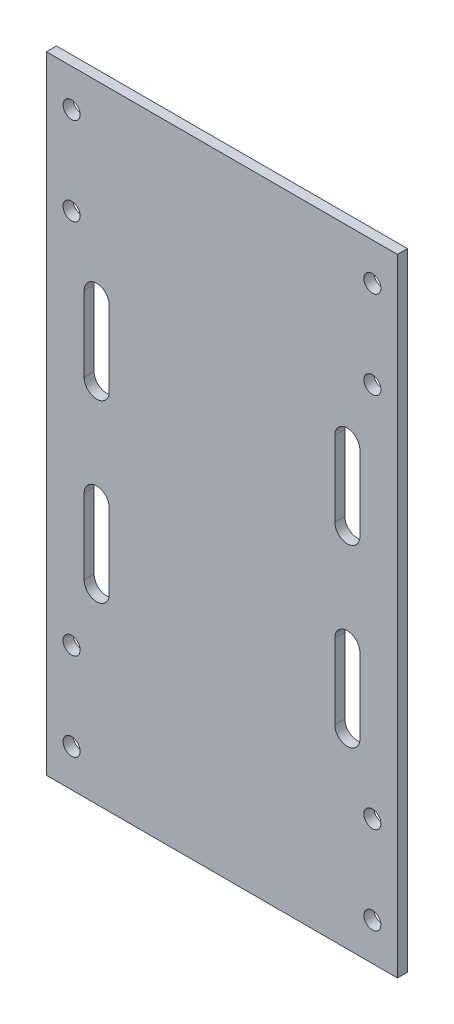
ISO-10303-21;
HEADER;
FILE_DESCRIPTION(('STEP AP214'),'2;1');
FILE_NAME('part.step','',(''),(''),'','','');
FILE_SCHEMA(('AUTOMOTIVE_DESIGN { 1 0 10303 214 1 1 1 1 }'));
ENDSEC;
DATA;
#1=APPLICATION_CONTEXT('core data for automotive mechanical design processes');
#2=APPLICATION_PROTOCOL_DEFINITION('international standard','automotive_design',2000,#1);
#3=PRODUCT_CONTEXT('',#1,'mechanical');
#4=PRODUCT('Part','Part','',(#3));
#5=PRODUCT_RELATED_PRODUCT_CATEGORY('part','',(#4));
#6=PRODUCT_DEFINITION_FORMATION('','',#4);
#7=PRODUCT_DEFINITION_CONTEXT('part definition',#1,'design');
#8=PRODUCT_DEFINITION('design','',#6,#7);
#9=PRODUCT_DEFINITION_SHAPE('','',#8);
#10=(LENGTH_UNIT() NAMED_UNIT(*) SI_UNIT(.MILLI.,.METRE.));
#11=(NAMED_UNIT(*) PLANE_ANGLE_UNIT() SI_UNIT($,.RADIAN.));
#12=(NAMED_UNIT(*) SI_UNIT($,.STERADIAN.) SOLID_ANGLE_UNIT());
#13=UNCERTAINTY_MEASURE_WITH_UNIT(LENGTH_MEASURE(1.E-05),#10,'distance_accuracy_value','');
#14=(GEOMETRIC_REPRESENTATION_CONTEXT(3) GLOBAL_UNCERTAINTY_ASSIGNED_CONTEXT((#13)) GLOBAL_UNIT_ASSIGNED_CONTEXT((#10,
#11,#12)) REPRESENTATION_CONTEXT('',''));
#15=CARTESIAN_POINT('',(0.,0.,0.));
#16=DIRECTION('',(0.,0.,1.));
#17=DIRECTION('',(1.,0.,0.));
#18=AXIS2_PLACEMENT_3D('',#15,#16,#17);
#19=CARTESIAN_POINT('',(0.,0.,0.));
#20=DIRECTION('',(0.,0.,-1.));
#21=DIRECTION('',(-1.,0.,0.));
#22=AXIS2_PLACEMENT_3D('',#19,#20,#21);
#23=PLANE('',#22);
#24=CARTESIAN_POINT('',(25.,-25.,0.));
#25=DIRECTION('',(0.,0.,-1.));
#26=DIRECTION('',(-1.,0.,0.));
#27=AXIS2_PLACEMENT_3D('',#24,#25,#26);
#28=CIRCLE('',#27,2.5);
#29=CARTESIAN_POINT('',(22.5,-25.,0.));
#30=VERTEX_POINT('',#29);
#31=CARTESIAN_POINT('',(27.5,-25.,0.));
#32=VERTEX_POINT('',#31);
#33=EDGE_CURVE('E517',#30,#32,#28,.F.);
#34=ORIENTED_EDGE('',*,*,#33,.F.);
#35=DIRECTION('',(0.,-1.,0.));
#36=VECTOR('',#35,1.);
#37=CARTESIAN_POINT('',(22.5,0.,0.));
#38=LINE('',#37,#36);
#39=CARTESIAN_POINT('',(22.5,-10.,0.));
#40=VERTEX_POINT('',#39);
#41=EDGE_CURVE('E270',#40,#30,#38,.T.);
#42=ORIENTED_EDGE('',*,*,#41,.F.);
#43=CARTESIAN_POINT('',(25.,-10.,0.));
#44=DIRECTION('',(0.,0.,-1.));
#45=DIRECTION('',(-1.,0.,0.));
#46=AXIS2_PLACEMENT_3D('',#43,#44,#45);
#47=CIRCLE('',#46,2.5);
#48=CARTESIAN_POINT('',(27.5,-10.,0.));
#49=VERTEX_POINT('',#48);
#50=EDGE_CURVE('E523',#49,#40,#47,.F.);
#51=ORIENTED_EDGE('',*,*,#50,.F.);
#52=DIRECTION('',(0.,1.,0.));
#53=VECTOR('',#52,1.);
#54=CARTESIAN_POINT('',(27.5,0.,0.));
#55=LINE('',#54,#53);
#56=EDGE_CURVE('E269',#32,#49,#55,.T.);
#57=ORIENTED_EDGE('',*,*,#56,.F.);
#58=EDGE_LOOP('',(#34,#42,#51,#57));
#59=FACE_BOUND('',#58,.T.);
#60=CARTESIAN_POINT('',(-25.,25.,0.));
#61=DIRECTION('',(0.,0.,-1.));
#62=DIRECTION('',(-1.,0.,0.));
#63=AXIS2_PLACEMENT_3D('',#60,#61,#62);
#64=CIRCLE('',#63,2.5);
#65=CARTESIAN_POINT('',(-22.5,25.,0.));
#66=VERTEX_POINT('',#65);
#67=CARTESIAN_POINT('',(-27.5,25.,0.));
#68=VERTEX_POINT('',#67);
#69=EDGE_CURVE('E526',#66,#68,#64,.F.);
#70=ORIENTED_EDGE('',*,*,#69,.F.);
#71=DIRECTION('',(0.,1.,0.));
#72=VECTOR('',#71,1.);
#73=CARTESIAN_POINT('',(-22.5,0.,0.));
#74=LINE('',#73,#72);
#75=CARTESIAN_POINT('',(-22.5,10.,0.));
#76=VERTEX_POINT('',#75);
#77=EDGE_CURVE('E279',#76,#66,#74,.T.);
#78=ORIENTED_EDGE('',*,*,#77,.F.);
#79=CARTESIAN_POINT('',(-25.,10.,0.));
#80=DIRECTION('',(0.,0.,-1.));
#81=DIRECTION('',(-1.,0.,0.));
#82=AXIS2_PLACEMENT_3D('',#79,#80,#81);
#83=CIRCLE('',#82,2.5);
#84=CARTESIAN_POINT('',(-27.5,10.,0.));
#85=VERTEX_POINT('',#84);
#86=EDGE_CURVE('E199',#85,#76,#83,.F.);
#87=ORIENTED_EDGE('',*,*,#86,.F.);
#88=DIRECTION('',(0.,-1.,0.));
#89=VECTOR('',#88,1.);
#90=CARTESIAN_POINT('',(-27.5,0.,0.));
#91=LINE('',#90,#89);
#92=EDGE_CURVE('E271',#68,#85,#91,.T.);
#93=ORIENTED_EDGE('',*,*,#92,.F.);
#94=EDGE_LOOP('',(#70,#78,#87,#93));
#95=FACE_BOUND('',#94,.T.);
#96=CARTESIAN_POINT('',(-25.,-10.,0.));
#97=DIRECTION('',(0.,0.,-1.));
#98=DIRECTION('',(-1.,0.,0.));
#99=AXIS2_PLACEMENT_3D('',#96,#97,#98);
#100=CIRCLE('',#99,2.5);
#101=CARTESIAN_POINT('',(-22.5,-10.,0.));
#102=VERTEX_POINT('',#101);
#103=CARTESIAN_POINT('',(-27.5,-10.,0.));
#104=VERTEX_POINT('',#103);
#105=EDGE_CURVE('E540',#102,#104,#100,.F.);
#106=ORIENTED_EDGE('',*,*,#105,.F.);
#107=DIRECTION('',(0.,1.,0.));
#108=VECTOR('',#107,1.);
#109=CARTESIAN_POINT('',(-22.5,0.,0.));
#110=LINE('',#109,#108);
#111=CARTESIAN_POINT('',(-22.5,-25.,0.));
#112=VERTEX_POINT('',#111);
#113=EDGE_CURVE('E260',#112,#102,#110,.T.);
#114=ORIENTED_EDGE('',*,*,#113,.F.);
#115=CARTESIAN_POINT('',(-25.,-25.,0.));
#116=DIRECTION('',(0.,0.,-1.));
#117=DIRECTION('',(-1.,0.,0.));
#118=AXIS2_PLACEMENT_3D('',#115,#116,#117);
#119=CIRCLE('',#118,2.5);
#120=CARTESIAN_POINT('',(-27.5,-25.,0.));
#121=VERTEX_POINT('',#120);
#122=EDGE_CURVE('E539',#121,#112,#119,.F.);
#123=ORIENTED_EDGE('',*,*,#122,.F.);
#124=DIRECTION('',(0.,-1.,0.));
#125=VECTOR('',#124,1.);
#126=CARTESIAN_POINT('',(-27.5,0.,0.));
#127=LINE('',#126,#125);
#128=EDGE_CURVE('E253',#104,#121,#127,.T.);
#129=ORIENTED_EDGE('',*,*,#128,.F.);
#130=EDGE_LOOP('',(#106,#114,#123,#129));
#131=FACE_BOUND('',#130,.T.);
#132=CARTESIAN_POINT('',(25.,10.,0.));
#133=DIRECTION('',(0.,0.,-1.));
#134=DIRECTION('',(-1.,0.,0.));
#135=AXIS2_PLACEMENT_3D('',#132,#133,#134);
#136=CIRCLE('',#135,2.5);
#137=CARTESIAN_POINT('',(22.5,10.,0.));
#138=VERTEX_POINT('',#137);
#139=CARTESIAN_POINT('',(27.5,10.,0.));
#140=VERTEX_POINT('',#139);
#141=EDGE_CURVE('E527',#138,#140,#136,.F.);
#142=ORIENTED_EDGE('',*,*,#141,.F.);
#143=DIRECTION('',(0.,-1.,0.));
#144=VECTOR('',#143,1.);
#145=CARTESIAN_POINT('',(22.5,0.,0.));
#146=LINE('',#145,#144);
#147=CARTESIAN_POINT('',(22.5,25.,0.));
#148=VERTEX_POINT('',#147);
#149=EDGE_CURVE('E262',#148,#138,#146,.T.);
#150=ORIENTED_EDGE('',*,*,#149,.F.);
#151=CARTESIAN_POINT('',(25.,25.,0.));
#152=DIRECTION('',(0.,0.,-1.));
#153=DIRECTION('',(-1.,0.,0.));
#154=AXIS2_PLACEMENT_3D('',#151,#152,#153);
#155=CIRCLE('',#154,2.5);
#156=CARTESIAN_POINT('',(27.5,25.,0.));
#157=VERTEX_POINT('',#156);
#158=EDGE_CURVE('E534',#157,#148,#155,.F.);
#159=ORIENTED_EDGE('',*,*,#158,.F.);
#160=DIRECTION('',(0.,1.,0.));
#161=VECTOR('',#160,1.);
#162=CARTESIAN_POINT('',(27.5,0.,0.));
#163=LINE('',#162,#161);
#164=EDGE_CURVE('E261',#140,#157,#163,.T.);
#165=ORIENTED_EDGE('',*,*,#164,.F.);
#166=EDGE_LOOP('',(#142,#150,#159,#165));
#167=FACE_BOUND('',#166,.T.);
#168=DIRECTION('',(0.,1.,0.));
#169=VECTOR('',#168,1.);
#170=CARTESIAN_POINT('',(35.,-62.5,0.));
#171=LINE('',#170,#169);
#172=CARTESIAN_POINT('',(35.,-62.5,0.));
#173=VERTEX_POINT('',#172);
#174=CARTESIAN_POINT('',(35.,62.5,0.));
#175=VERTEX_POINT('',#174);
#176=EDGE_CURVE('E855',#173,#175,#171,.T.);
#177=ORIENTED_EDGE('',*,*,#176,.T.);
#178=DIRECTION('',(-1.,0.,0.));
#179=VECTOR('',#178,1.);
#180=CARTESIAN_POINT('',(-35.,62.5,0.));
#181=LINE('',#180,#179);
#182=CARTESIAN_POINT('',(-35.,62.5,0.));
#183=VERTEX_POINT('',#182);
#184=EDGE_CURVE('E854',#175,#183,#181,.T.);
#185=ORIENTED_EDGE('',*,*,#184,.T.);
#186=DIRECTION('',(0.,-1.,0.));
#187=VECTOR('',#186,1.);
#188=CARTESIAN_POINT('',(-35.,-62.5,0.));
#189=LINE('',#188,#187);
#190=CARTESIAN_POINT('',(-35.,-62.5,0.));
#191=VERTEX_POINT('',#190);
#192=EDGE_CURVE('E859',#183,#191,#189,.T.);
#193=ORIENTED_EDGE('',*,*,#192,.T.);
#194=DIRECTION('',(1.,0.,0.));
#195=VECTOR('',#194,1.);
#196=CARTESIAN_POINT('',(-35.,-62.5,0.));
#197=LINE('',#196,#195);
#198=EDGE_CURVE('E860',#191,#173,#197,.T.);
#199=ORIENTED_EDGE('',*,*,#198,.T.);
#200=EDGE_LOOP('',(#177,#185,#193,#199));
#201=FACE_BOUND('',#200,.T.);
#202=CARTESIAN_POINT('',(-30.,-55.,1.2E-05));
#203=DIRECTION('',(0.,0.,1.));
#204=DIRECTION('',(1.,0.,0.));
#205=AXIS2_PLACEMENT_3D('',#202,#203,#204);
#206=CIRCLE('',#205,1.7);
#207=CARTESIAN_POINT('',(-28.3,-55.,1.2E-05));
#208=VERTEX_POINT('',#207);
#209=EDGE_CURVE('E307',#208,#208,#206,.T.);
#210=ORIENTED_EDGE('',*,*,#209,.F.);
#211=EDGE_LOOP('',(#210));
#212=FACE_BOUND('',#211,.T.);
#213=CARTESIAN_POINT('',(30.,55.,1.2E-05));
#214=DIRECTION('',(0.,0.,1.));
#215=DIRECTION('',(1.,0.,0.));
#216=AXIS2_PLACEMENT_3D('',#213,#214,#215);
#217=CIRCLE('',#216,1.7);
#218=CARTESIAN_POINT('',(31.7,55.,1.2E-05));
#219=VERTEX_POINT('',#218);
#220=EDGE_CURVE('E280',#219,#219,#217,.T.);
#221=ORIENTED_EDGE('',*,*,#220,.F.);
#222=EDGE_LOOP('',(#221));
#223=FACE_BOUND('',#222,.T.);
#224=CARTESIAN_POINT('',(30.,37.5,1.2E-05));
#225=DIRECTION('',(0.,0.,1.));
#226=DIRECTION('',(1.,0.,0.));
#227=AXIS2_PLACEMENT_3D('',#224,#225,#226);
#228=CIRCLE('',#227,1.7);
#229=CARTESIAN_POINT('',(31.7,37.5,1.2E-05));
#230=VERTEX_POINT('',#229);
#231=EDGE_CURVE('E290',#230,#230,#228,.T.);
#232=ORIENTED_EDGE('',*,*,#231,.F.);
#233=EDGE_LOOP('',(#232));
#234=FACE_BOUND('',#233,.T.);
#235=CARTESIAN_POINT('',(30.,-37.5,1.2E-05));
#236=DIRECTION('',(0.,0.,1.));
#237=DIRECTION('',(1.,0.,0.));
#238=AXIS2_PLACEMENT_3D('',#235,#236,#237);
#239=CIRCLE('',#238,1.7);
#240=CARTESIAN_POINT('',(31.7,-37.5,1.2E-05));
#241=VERTEX_POINT('',#240);
#242=EDGE_CURVE('E284',#241,#241,#239,.T.);
#243=ORIENTED_EDGE('',*,*,#242,.F.);
#244=EDGE_LOOP('',(#243));
#245=FACE_BOUND('',#244,.T.);
#246=CARTESIAN_POINT('',(-30.,-37.5,1.2E-05));
#247=DIRECTION('',(0.,0.,1.));
#248=DIRECTION('',(1.,0.,0.));
#249=AXIS2_PLACEMENT_3D('',#246,#247,#248);
#250=CIRCLE('',#249,1.7);
#251=CARTESIAN_POINT('',(-28.3,-37.5,1.2E-05));
#252=VERTEX_POINT('',#251);
#253=EDGE_CURVE('E303',#252,#252,#250,.T.);
#254=ORIENTED_EDGE('',*,*,#253,.F.);
#255=EDGE_LOOP('',(#254));
#256=FACE_BOUND('',#255,.T.);
#257=CARTESIAN_POINT('',(-30.,37.5,1.2E-05));
#258=DIRECTION('',(0.,0.,1.));
#259=DIRECTION('',(1.,0.,0.));
#260=AXIS2_PLACEMENT_3D('',#257,#258,#259);
#261=CIRCLE('',#260,1.7);
#262=CARTESIAN_POINT('',(-28.3,37.5,1.2E-05));
#263=VERTEX_POINT('',#262);
#264=EDGE_CURVE('E295',#263,#263,#261,.T.);
#265=ORIENTED_EDGE('',*,*,#264,.F.);
#266=EDGE_LOOP('',(#265));
#267=FACE_BOUND('',#266,.T.);
#268=CARTESIAN_POINT('',(-30.,55.,1.2E-05));
#269=DIRECTION('',(0.,0.,1.));
#270=DIRECTION('',(1.,0.,0.));
#271=AXIS2_PLACEMENT_3D('',#268,#269,#270);
#272=CIRCLE('',#271,1.7);
#273=CARTESIAN_POINT('',(-28.3,55.,1.2E-05));
#274=VERTEX_POINT('',#273);
#275=EDGE_CURVE('E294',#274,#274,#272,.T.);
#276=ORIENTED_EDGE('',*,*,#275,.F.);
#277=EDGE_LOOP('',(#276));
#278=FACE_BOUND('',#277,.T.);
#279=CARTESIAN_POINT('',(30.,-55.,1.2E-05));
#280=DIRECTION('',(0.,0.,1.));
#281=DIRECTION('',(1.,0.,0.));
#282=AXIS2_PLACEMENT_3D('',#279,#280,#281);
#283=CIRCLE('',#282,1.7);
#284=CARTESIAN_POINT('',(31.7,-55.,1.2E-05));
#285=VERTEX_POINT('',#284);
#286=EDGE_CURVE('E285',#285,#285,#283,.T.);
#287=ORIENTED_EDGE('',*,*,#286,.F.);
#288=EDGE_LOOP('',(#287));
#289=FACE_BOUND('',#288,.T.);
#290=ADVANCED_FACE('F44',(#59,#95,#131,#167,#201,#212,#223,#234,#245,#256,#267,#278,#289),#23,.F.);
#291=CARTESIAN_POINT('',(0.,0.,-2.));
#292=DIRECTION('',(0.,0.,-1.));
#293=DIRECTION('',(-1.,0.,0.));
#294=AXIS2_PLACEMENT_3D('',#291,#292,#293);
#295=PLANE('',#294);
#296=CARTESIAN_POINT('',(30.,-55.,-2.));
#297=DIRECTION('',(0.,0.,1.));
#298=DIRECTION('',(1.,0.,0.));
#299=AXIS2_PLACEMENT_3D('',#296,#297,#298);
#300=CIRCLE('',#299,1.7);
#301=CARTESIAN_POINT('',(31.7,-55.,-2.));
#302=VERTEX_POINT('',#301);
#303=EDGE_CURVE('E298',#302,#302,#300,.T.);
#304=ORIENTED_EDGE('',*,*,#303,.T.);
#305=EDGE_LOOP('',(#304));
#306=FACE_BOUND('',#305,.T.);
#307=CARTESIAN_POINT('',(-30.,55.,-2.));
#308=DIRECTION('',(0.,0.,1.));
#309=DIRECTION('',(1.,0.,0.));
#310=AXIS2_PLACEMENT_3D('',#307,#308,#309);
#311=CIRCLE('',#310,1.7);
#312=CARTESIAN_POINT('',(-28.3,55.,-2.));
#313=VERTEX_POINT('',#312);
#314=EDGE_CURVE('E293',#313,#313,#311,.T.);
#315=ORIENTED_EDGE('',*,*,#314,.T.);
#316=EDGE_LOOP('',(#315));
#317=FACE_BOUND('',#316,.T.);
#318=CARTESIAN_POINT('',(-30.,37.5,-2.));
#319=DIRECTION('',(0.,0.,1.));
#320=DIRECTION('',(1.,0.,0.));
#321=AXIS2_PLACEMENT_3D('',#318,#319,#320);
#322=CIRCLE('',#321,1.7);
#323=CARTESIAN_POINT('',(-28.3,37.5,-2.));
#324=VERTEX_POINT('',#323);
#325=EDGE_CURVE('E302',#324,#324,#322,.T.);
#326=ORIENTED_EDGE('',*,*,#325,.T.);
#327=EDGE_LOOP('',(#326));
#328=FACE_BOUND('',#327,.T.);
#329=CARTESIAN_POINT('',(-30.,-37.5,-2.));
#330=DIRECTION('',(0.,0.,1.));
#331=DIRECTION('',(1.,0.,0.));
#332=AXIS2_PLACEMENT_3D('',#329,#330,#331);
#333=CIRCLE('',#332,1.7);
#334=CARTESIAN_POINT('',(-28.3,-37.5,-2.));
#335=VERTEX_POINT('',#334);
#336=EDGE_CURVE('E299',#335,#335,#333,.T.);
#337=ORIENTED_EDGE('',*,*,#336,.T.);
#338=EDGE_LOOP('',(#337));
#339=FACE_BOUND('',#338,.T.);
#340=CARTESIAN_POINT('',(30.,-37.5,-2.));
#341=DIRECTION('',(0.,0.,1.));
#342=DIRECTION('',(1.,0.,0.));
#343=AXIS2_PLACEMENT_3D('',#340,#341,#342);
#344=CIRCLE('',#343,1.7);
#345=CARTESIAN_POINT('',(31.7,-37.5,-2.));
#346=VERTEX_POINT('',#345);
#347=EDGE_CURVE('E278',#346,#346,#344,.T.);
#348=ORIENTED_EDGE('',*,*,#347,.T.);
#349=EDGE_LOOP('',(#348));
#350=FACE_BOUND('',#349,.T.);
#351=CARTESIAN_POINT('',(30.,37.5,-2.));
#352=DIRECTION('',(0.,0.,1.));
#353=DIRECTION('',(1.,0.,0.));
#354=AXIS2_PLACEMENT_3D('',#351,#352,#353);
#355=CIRCLE('',#354,1.7);
#356=CARTESIAN_POINT('',(31.7,37.5,-2.));
#357=VERTEX_POINT('',#356);
#358=EDGE_CURVE('E281',#357,#357,#355,.T.);
#359=ORIENTED_EDGE('',*,*,#358,.T.);
#360=EDGE_LOOP('',(#359));
#361=FACE_BOUND('',#360,.T.);
#362=CARTESIAN_POINT('',(30.,55.,-2.));
#363=DIRECTION('',(0.,0.,1.));
#364=DIRECTION('',(1.,0.,0.));
#365=AXIS2_PLACEMENT_3D('',#362,#363,#364);
#366=CIRCLE('',#365,1.7);
#367=CARTESIAN_POINT('',(31.7,55.,-2.));
#368=VERTEX_POINT('',#367);
#369=EDGE_CURVE('E287',#368,#368,#366,.T.);
#370=ORIENTED_EDGE('',*,*,#369,.T.);
#371=EDGE_LOOP('',(#370));
#372=FACE_BOUND('',#371,.T.);
#373=CARTESIAN_POINT('',(-30.,-55.,-2.));
#374=DIRECTION('',(0.,0.,1.));
#375=DIRECTION('',(1.,0.,0.));
#376=AXIS2_PLACEMENT_3D('',#373,#374,#375);
#377=CIRCLE('',#376,1.7);
#378=CARTESIAN_POINT('',(-28.3,-55.,-2.));
#379=VERTEX_POINT('',#378);
#380=EDGE_CURVE('E305',#379,#379,#377,.T.);
#381=ORIENTED_EDGE('',*,*,#380,.T.);
#382=EDGE_LOOP('',(#381));
#383=FACE_BOUND('',#382,.T.);
#384=DIRECTION('',(0.,1.,0.));
#385=VECTOR('',#384,1.);
#386=CARTESIAN_POINT('',(35.,-62.5,-2.));
#387=LINE('',#386,#385);
#388=CARTESIAN_POINT('',(35.,-62.5,-2.));
#389=VERTEX_POINT('',#388);
#390=CARTESIAN_POINT('',(35.,62.5,-2.));
#391=VERTEX_POINT('',#390);
#392=EDGE_CURVE('E410',#389,#391,#387,.T.);
#393=ORIENTED_EDGE('',*,*,#392,.F.);
#394=DIRECTION('',(1.,0.,0.));
#395=VECTOR('',#394,1.);
#396=CARTESIAN_POINT('',(-35.,-62.5,-2.));
#397=LINE('',#396,#395);
#398=CARTESIAN_POINT('',(-35.,-62.5,-2.));
#399=VERTEX_POINT('',#398);
#400=EDGE_CURVE('E869',#399,#389,#397,.T.);
#401=ORIENTED_EDGE('',*,*,#400,.F.);
#402=DIRECTION('',(0.,-1.,0.));
#403=VECTOR('',#402,1.);
#404=CARTESIAN_POINT('',(-35.,-62.5,-2.));
#405=LINE('',#404,#403);
#406=CARTESIAN_POINT('',(-35.,62.5,-2.));
#407=VERTEX_POINT('',#406);
#408=EDGE_CURVE('E894',#407,#399,#405,.T.);
#409=ORIENTED_EDGE('',*,*,#408,.F.);
#410=DIRECTION('',(-1.,0.,0.));
#411=VECTOR('',#410,1.);
#412=CARTESIAN_POINT('',(-35.,62.5,-2.));
#413=LINE('',#412,#411);
#414=EDGE_CURVE('E864',#391,#407,#413,.T.);
#415=ORIENTED_EDGE('',*,*,#414,.F.);
#416=EDGE_LOOP('',(#393,#401,#409,#415));
#417=FACE_BOUND('',#416,.T.);
#418=DIRECTION('',(0.,1.,0.));
#419=VECTOR('',#418,1.);
#420=CARTESIAN_POINT('',(-22.5,-25.,-2.));
#421=LINE('',#420,#419);
#422=CARTESIAN_POINT('',(-22.5,-25.,-2.));
#423=VERTEX_POINT('',#422);
#424=CARTESIAN_POINT('',(-22.5,-10.,-2.));
#425=VERTEX_POINT('',#424);
#426=EDGE_CURVE('E216',#423,#425,#421,.T.);
#427=ORIENTED_EDGE('',*,*,#426,.T.);
#428=CARTESIAN_POINT('',(-25.,-10.,-2.));
#429=DIRECTION('',(0.,0.,1.));
#430=DIRECTION('',(1.,0.,0.));
#431=AXIS2_PLACEMENT_3D('',#428,#429,#430);
#432=CIRCLE('',#431,2.5);
#433=CARTESIAN_POINT('',(-27.5,-10.,-2.));
#434=VERTEX_POINT('',#433);
#435=EDGE_CURVE('E215',#425,#434,#432,.T.);
#436=ORIENTED_EDGE('',*,*,#435,.T.);
#437=DIRECTION('',(0.,-1.,0.));
#438=VECTOR('',#437,1.);
#439=CARTESIAN_POINT('',(-27.5,-25.,-2.));
#440=LINE('',#439,#438);
#441=CARTESIAN_POINT('',(-27.5,-25.,-2.));
#442=VERTEX_POINT('',#441);
#443=EDGE_CURVE('E225',#434,#442,#440,.T.);
#444=ORIENTED_EDGE('',*,*,#443,.T.);
#445=CARTESIAN_POINT('',(-25.,-25.,-2.));
#446=DIRECTION('',(0.,0.,1.));
#447=DIRECTION('',(1.,0.,0.));
#448=AXIS2_PLACEMENT_3D('',#445,#446,#447);
#449=CIRCLE('',#448,2.5);
#450=EDGE_CURVE('E565',#442,#423,#449,.T.);
#451=ORIENTED_EDGE('',*,*,#450,.T.);
#452=EDGE_LOOP('',(#427,#436,#444,#451));
#453=FACE_BOUND('',#452,.T.);
#454=DIRECTION('',(0.,-1.,0.));
#455=VECTOR('',#454,1.);
#456=CARTESIAN_POINT('',(22.5,10.,-2.));
#457=LINE('',#456,#455);
#458=CARTESIAN_POINT('',(22.5,25.,-2.));
#459=VERTEX_POINT('',#458);
#460=CARTESIAN_POINT('',(22.5,10.,-2.));
#461=VERTEX_POINT('',#460);
#462=EDGE_CURVE('E506',#459,#461,#457,.T.);
#463=ORIENTED_EDGE('',*,*,#462,.T.);
#464=CARTESIAN_POINT('',(25.,10.,-2.));
#465=DIRECTION('',(0.,0.,1.));
#466=DIRECTION('',(1.,0.,0.));
#467=AXIS2_PLACEMENT_3D('',#464,#465,#466);
#468=CIRCLE('',#467,2.5);
#469=CARTESIAN_POINT('',(27.5,10.,-2.));
#470=VERTEX_POINT('',#469);
#471=EDGE_CURVE('E569',#461,#470,#468,.T.);
#472=ORIENTED_EDGE('',*,*,#471,.T.);
#473=DIRECTION('',(0.,1.,0.));
#474=VECTOR('',#473,1.);
#475=CARTESIAN_POINT('',(27.5,10.,-2.));
#476=LINE('',#475,#474);
#477=CARTESIAN_POINT('',(27.5,25.,-2.));
#478=VERTEX_POINT('',#477);
#479=EDGE_CURVE('E229',#470,#478,#476,.T.);
#480=ORIENTED_EDGE('',*,*,#479,.T.);
#481=CARTESIAN_POINT('',(25.,25.,-2.));
#482=DIRECTION('',(0.,0.,1.));
#483=DIRECTION('',(1.,0.,0.));
#484=AXIS2_PLACEMENT_3D('',#481,#482,#483);
#485=CIRCLE('',#484,2.5);
#486=EDGE_CURVE('E568',#478,#459,#485,.T.);
#487=ORIENTED_EDGE('',*,*,#486,.T.);
#488=EDGE_LOOP('',(#463,#472,#480,#487));
#489=FACE_BOUND('',#488,.T.);
#490=DIRECTION('',(0.,-1.,0.));
#491=VECTOR('',#490,1.);
#492=CARTESIAN_POINT('',(22.5,-25.,-2.));
#493=LINE('',#492,#491);
#494=CARTESIAN_POINT('',(22.5,-10.,-2.));
#495=VERTEX_POINT('',#494);
#496=CARTESIAN_POINT('',(22.5,-25.,-2.));
#497=VERTEX_POINT('',#496);
#498=EDGE_CURVE('E240',#495,#497,#493,.T.);
#499=ORIENTED_EDGE('',*,*,#498,.T.);
#500=CARTESIAN_POINT('',(25.,-25.,-2.));
#501=DIRECTION('',(0.,0.,1.));
#502=DIRECTION('',(1.,0.,0.));
#503=AXIS2_PLACEMENT_3D('',#500,#501,#502);
#504=CIRCLE('',#503,2.5);
#505=CARTESIAN_POINT('',(27.5,-25.,-2.));
#506=VERTEX_POINT('',#505);
#507=EDGE_CURVE('E509',#497,#506,#504,.T.);
#508=ORIENTED_EDGE('',*,*,#507,.T.);
#509=DIRECTION('',(0.,1.,0.));
#510=VECTOR('',#509,1.);
#511=CARTESIAN_POINT('',(27.5,-25.,-2.));
#512=LINE('',#511,#510);
#513=CARTESIAN_POINT('',(27.5,-10.,-2.));
#514=VERTEX_POINT('',#513);
#515=EDGE_CURVE('E239',#506,#514,#512,.T.);
#516=ORIENTED_EDGE('',*,*,#515,.T.);
#517=CARTESIAN_POINT('',(25.,-10.,-2.));
#518=DIRECTION('',(0.,0.,1.));
#519=DIRECTION('',(1.,0.,0.));
#520=AXIS2_PLACEMENT_3D('',#517,#518,#519);
#521=CIRCLE('',#520,2.5);
#522=EDGE_CURVE('E515',#514,#495,#521,.T.);
#523=ORIENTED_EDGE('',*,*,#522,.T.);
#524=EDGE_LOOP('',(#499,#508,#516,#523));
#525=FACE_BOUND('',#524,.T.);
#526=DIRECTION('',(0.,1.,0.));
#527=VECTOR('',#526,1.);
#528=CARTESIAN_POINT('',(-22.5,10.,-2.));
#529=LINE('',#528,#527);
#530=CARTESIAN_POINT('',(-22.5,10.,-2.));
#531=VERTEX_POINT('',#530);
#532=CARTESIAN_POINT('',(-22.5,25.,-2.));
#533=VERTEX_POINT('',#532);
#534=EDGE_CURVE('E214',#531,#533,#529,.T.);
#535=ORIENTED_EDGE('',*,*,#534,.T.);
#536=CARTESIAN_POINT('',(-25.,25.,-2.));
#537=DIRECTION('',(0.,0.,1.));
#538=DIRECTION('',(1.,0.,0.));
#539=AXIS2_PLACEMENT_3D('',#536,#537,#538);
#540=CIRCLE('',#539,2.5);
#541=CARTESIAN_POINT('',(-27.5,25.,-2.));
#542=VERTEX_POINT('',#541);
#543=EDGE_CURVE('E213',#533,#542,#540,.T.);
#544=ORIENTED_EDGE('',*,*,#543,.T.);
#545=DIRECTION('',(0.,-1.,0.));
#546=VECTOR('',#545,1.);
#547=CARTESIAN_POINT('',(-27.5,10.,-2.));
#548=LINE('',#547,#546);
#549=CARTESIAN_POINT('',(-27.5,10.,-2.));
#550=VERTEX_POINT('',#549);
#551=EDGE_CURVE('E202',#542,#550,#548,.T.);
#552=ORIENTED_EDGE('',*,*,#551,.T.);
#553=CARTESIAN_POINT('',(-25.,10.,-2.));
#554=DIRECTION('',(0.,0.,1.));
#555=DIRECTION('',(1.,0.,0.));
#556=AXIS2_PLACEMENT_3D('',#553,#554,#555);
#557=CIRCLE('',#556,2.5);
#558=EDGE_CURVE('E192',#550,#531,#557,.T.);
#559=ORIENTED_EDGE('',*,*,#558,.T.);
#560=EDGE_LOOP('',(#535,#544,#552,#559));
#561=FACE_BOUND('',#560,.T.);
#562=ADVANCED_FACE('F209',(#306,#317,#328,#339,#350,#361,#372,#383,#417,#453,#489,#525,#561),
#295,.T.);
#563=CARTESIAN_POINT('',(35.,-62.5,-2.));
#564=DIRECTION('',(1.,0.,0.));
#565=DIRECTION('',(0.,0.,-1.));
#566=AXIS2_PLACEMENT_3D('',#563,#564,#565);
#567=PLANE('',#566);
#568=ORIENTED_EDGE('',*,*,#176,.F.);
#569=DIRECTION('',(0.,0.,1.));
#570=VECTOR('',#569,1.);
#571=CARTESIAN_POINT('',(35.,-62.5,-2.));
#572=LINE('',#571,#570);
#573=EDGE_CURVE('E11',#389,#173,#572,.T.);
#574=ORIENTED_EDGE('',*,*,#573,.F.);
#575=ORIENTED_EDGE('',*,*,#392,.T.);
#576=DIRECTION('',(0.,0.,1.));
#577=VECTOR('',#576,1.);
#578=CARTESIAN_POINT('',(35.,62.5,-2.));
#579=LINE('',#578,#577);
#580=EDGE_CURVE('E95',#391,#175,#579,.T.);
#581=ORIENTED_EDGE('',*,*,#580,.T.);
#582=EDGE_LOOP('',(#568,#574,#575,#581));
#583=FACE_BOUND('',#582,.T.);
#584=ADVANCED_FACE('F50',(#583),#567,.T.);
#585=CARTESIAN_POINT('',(-35.,-62.5,-2.));
#586=DIRECTION('',(0.,-1.,0.));
#587=DIRECTION('',(0.,0.,-1.));
#588=AXIS2_PLACEMENT_3D('',#585,#586,#587);
#589=PLANE('',#588);
#590=ORIENTED_EDGE('',*,*,#198,.F.);
#591=DIRECTION('',(0.,0.,1.));
#592=VECTOR('',#591,1.);
#593=CARTESIAN_POINT('',(-35.,-62.5,-2.));
#594=LINE('',#593,#592);
#595=EDGE_CURVE('E60',#399,#191,#594,.T.);
#596=ORIENTED_EDGE('',*,*,#595,.F.);
#597=ORIENTED_EDGE('',*,*,#400,.T.);
#598=ORIENTED_EDGE('',*,*,#573,.T.);
#599=EDGE_LOOP('',(#590,#596,#597,#598));
#600=FACE_BOUND('',#599,.T.);
#601=ADVANCED_FACE('F428',(#600),#589,.T.);
#602=CARTESIAN_POINT('',(-35.,-62.5,-2.));
#603=DIRECTION('',(-1.,0.,0.));
#604=DIRECTION('',(0.,0.,1.));
#605=AXIS2_PLACEMENT_3D('',#602,#603,#604);
#606=PLANE('',#605);
#607=ORIENTED_EDGE('',*,*,#192,.F.);
#608=DIRECTION('',(0.,0.,1.));
#609=VECTOR('',#608,1.);
#610=CARTESIAN_POINT('',(-35.,62.5,-2.));
#611=LINE('',#610,#609);
#612=EDGE_CURVE('E867',#407,#183,#611,.T.);
#613=ORIENTED_EDGE('',*,*,#612,.F.);
#614=ORIENTED_EDGE('',*,*,#408,.T.);
#615=ORIENTED_EDGE('',*,*,#595,.T.);
#616=EDGE_LOOP('',(#607,#613,#614,#615));
#617=FACE_BOUND('',#616,.T.);
#618=ADVANCED_FACE('F713',(#617),#606,.T.);
#619=CARTESIAN_POINT('',(-35.,62.5,-2.));
#620=DIRECTION('',(0.,1.,0.));
#621=DIRECTION('',(0.,0.,1.));
#622=AXIS2_PLACEMENT_3D('',#619,#620,#621);
#623=PLANE('',#622);
#624=ORIENTED_EDGE('',*,*,#184,.F.);
#625=ORIENTED_EDGE('',*,*,#580,.F.);
#626=ORIENTED_EDGE('',*,*,#414,.T.);
#627=ORIENTED_EDGE('',*,*,#612,.T.);
#628=EDGE_LOOP('',(#624,#625,#626,#627));
#629=FACE_BOUND('',#628,.T.);
#630=ADVANCED_FACE('F418',(#629),#623,.T.);
#631=CARTESIAN_POINT('',(-30.,-55.,1.2E-05));
#632=DIRECTION('',(0.,0.,-1.));
#633=DIRECTION('',(-1.,0.,0.));
#634=AXIS2_PLACEMENT_3D('',#631,#632,#633);
#635=CYLINDRICAL_SURFACE('',#634,1.7);
#636=ORIENTED_EDGE('',*,*,#209,.T.);
#637=EDGE_LOOP('',(#636));
#638=FACE_BOUND('',#637,.T.);
#639=ORIENTED_EDGE('',*,*,#380,.F.);
#640=EDGE_LOOP('',(#639));
#641=FACE_BOUND('',#640,.T.);
#642=ADVANCED_FACE('F407',(#638,#641),#635,.F.);
#643=CARTESIAN_POINT('',(30.,55.,1.2E-05));
#644=DIRECTION('',(0.,0.,-1.));
#645=DIRECTION('',(-1.,0.,0.));
#646=AXIS2_PLACEMENT_3D('',#643,#644,#645);
#647=CYLINDRICAL_SURFACE('',#646,1.7);
#648=ORIENTED_EDGE('',*,*,#220,.T.);
#649=EDGE_LOOP('',(#648));
#650=FACE_BOUND('',#649,.T.);
#651=ORIENTED_EDGE('',*,*,#369,.F.);
#652=EDGE_LOOP('',(#651));
#653=FACE_BOUND('',#652,.T.);
#654=ADVANCED_FACE('F377',(#650,#653),#647,.F.);
#655=CARTESIAN_POINT('',(30.,37.5,1.2E-05));
#656=DIRECTION('',(0.,0.,-1.));
#657=DIRECTION('',(-1.,0.,0.));
#658=AXIS2_PLACEMENT_3D('',#655,#656,#657);
#659=CYLINDRICAL_SURFACE('',#658,1.7);
#660=ORIENTED_EDGE('',*,*,#231,.T.);
#661=EDGE_LOOP('',(#660));
#662=FACE_BOUND('',#661,.T.);
#663=ORIENTED_EDGE('',*,*,#358,.F.);
#664=EDGE_LOOP('',(#663));
#665=FACE_BOUND('',#664,.T.);
#666=ADVANCED_FACE('F372',(#662,#665),#659,.F.);
#667=CARTESIAN_POINT('',(30.,-37.5,1.2E-05));
#668=DIRECTION('',(0.,0.,-1.));
#669=DIRECTION('',(-1.,0.,0.));
#670=AXIS2_PLACEMENT_3D('',#667,#668,#669);
#671=CYLINDRICAL_SURFACE('',#670,1.7);
#672=ORIENTED_EDGE('',*,*,#242,.T.);
#673=EDGE_LOOP('',(#672));
#674=FACE_BOUND('',#673,.T.);
#675=ORIENTED_EDGE('',*,*,#347,.F.);
#676=EDGE_LOOP('',(#675));
#677=FACE_BOUND('',#676,.T.);
#678=ADVANCED_FACE('F339',(#674,#677),#671,.F.);
#679=CARTESIAN_POINT('',(-30.,-37.5,1.2E-05));
#680=DIRECTION('',(0.,0.,-1.));
#681=DIRECTION('',(-1.,0.,0.));
#682=AXIS2_PLACEMENT_3D('',#679,#680,#681);
#683=CYLINDRICAL_SURFACE('',#682,1.7);
#684=ORIENTED_EDGE('',*,*,#253,.T.);
#685=EDGE_LOOP('',(#684));
#686=FACE_BOUND('',#685,.T.);
#687=ORIENTED_EDGE('',*,*,#336,.F.);
#688=EDGE_LOOP('',(#687));
#689=FACE_BOUND('',#688,.T.);
#690=ADVANCED_FACE('F333',(#686,#689),#683,.F.);
#691=CARTESIAN_POINT('',(-30.,37.5,1.2E-05));
#692=DIRECTION('',(0.,0.,-1.));
#693=DIRECTION('',(-1.,0.,0.));
#694=AXIS2_PLACEMENT_3D('',#691,#692,#693);
#695=CYLINDRICAL_SURFACE('',#694,1.7);
#696=ORIENTED_EDGE('',*,*,#264,.T.);
#697=EDGE_LOOP('',(#696));
#698=FACE_BOUND('',#697,.T.);
#699=ORIENTED_EDGE('',*,*,#325,.F.);
#700=EDGE_LOOP('',(#699));
#701=FACE_BOUND('',#700,.T.);
#702=ADVANCED_FACE('F336',(#698,#701),#695,.F.);
#703=CARTESIAN_POINT('',(-30.,55.,1.2E-05));
#704=DIRECTION('',(0.,0.,-1.));
#705=DIRECTION('',(-1.,0.,0.));
#706=AXIS2_PLACEMENT_3D('',#703,#704,#705);
#707=CYLINDRICAL_SURFACE('',#706,1.7);
#708=ORIENTED_EDGE('',*,*,#275,.T.);
#709=EDGE_LOOP('',(#708));
#710=FACE_BOUND('',#709,.T.);
#711=ORIENTED_EDGE('',*,*,#314,.F.);
#712=EDGE_LOOP('',(#711));
#713=FACE_BOUND('',#712,.T.);
#714=ADVANCED_FACE('F331',(#710,#713),#707,.F.);
#715=CARTESIAN_POINT('',(30.,-55.,1.2E-05));
#716=DIRECTION('',(0.,0.,-1.));
#717=DIRECTION('',(-1.,0.,0.));
#718=AXIS2_PLACEMENT_3D('',#715,#716,#717);
#719=CYLINDRICAL_SURFACE('',#718,1.7);
#720=ORIENTED_EDGE('',*,*,#286,.T.);
#721=EDGE_LOOP('',(#720));
#722=FACE_BOUND('',#721,.T.);
#723=ORIENTED_EDGE('',*,*,#303,.F.);
#724=EDGE_LOOP('',(#723));
#725=FACE_BOUND('',#724,.T.);
#726=ADVANCED_FACE('F318',(#722,#725),#719,.F.);
#727=CARTESIAN_POINT('',(-22.5,-25.,0.082677023314512));
#728=DIRECTION('',(-1.,0.,0.));
#729=DIRECTION('',(0.,0.,1.));
#730=AXIS2_PLACEMENT_3D('',#727,#728,#729);
#731=PLANE('',#730);
#732=ORIENTED_EDGE('',*,*,#113,.T.);
#733=DIRECTION('',(0.,0.,-1.));
#734=VECTOR('',#733,1.);
#735=CARTESIAN_POINT('',(-22.5,-10.,0.082677023314512));
#736=LINE('',#735,#734);
#737=EDGE_CURVE('E255',#102,#425,#736,.T.);
#738=ORIENTED_EDGE('',*,*,#737,.T.);
#739=ORIENTED_EDGE('',*,*,#426,.F.);
#740=DIRECTION('',(0.,0.,-1.));
#741=VECTOR('',#740,1.);
#742=CARTESIAN_POINT('',(-22.5,-25.,0.082677023314512));
#743=LINE('',#742,#741);
#744=EDGE_CURVE('E244',#112,#423,#743,.T.);
#745=ORIENTED_EDGE('',*,*,#744,.F.);
#746=EDGE_LOOP('',(#732,#738,#739,#745));
#747=FACE_BOUND('',#746,.T.);
#748=ADVANCED_FACE('F328',(#747),#731,.T.);
#749=CARTESIAN_POINT('',(-27.5,-25.,0.082677023314512));
#750=DIRECTION('',(1.,0.,0.));
#751=DIRECTION('',(0.,0.,-1.));
#752=AXIS2_PLACEMENT_3D('',#749,#750,#751);
#753=PLANE('',#752);
#754=ORIENTED_EDGE('',*,*,#128,.T.);
#755=DIRECTION('',(0.,0.,-1.));
#756=VECTOR('',#755,1.);
#757=CARTESIAN_POINT('',(-27.5,-25.,0.082677023314512));
#758=LINE('',#757,#756);
#759=EDGE_CURVE('E250',#121,#442,#758,.T.);
#760=ORIENTED_EDGE('',*,*,#759,.T.);
#761=ORIENTED_EDGE('',*,*,#443,.F.);
#762=DIRECTION('',(0.,0.,-1.));
#763=VECTOR('',#762,1.);
#764=CARTESIAN_POINT('',(-27.5,-10.,0.082677023314512));
#765=LINE('',#764,#763);
#766=EDGE_CURVE('E249',#104,#434,#765,.T.);
#767=ORIENTED_EDGE('',*,*,#766,.F.);
#768=EDGE_LOOP('',(#754,#760,#761,#767));
#769=FACE_BOUND('',#768,.T.);
#770=ADVANCED_FACE('F616',(#769),#753,.T.);
#771=CARTESIAN_POINT('',(27.5,10.,0.082677023314512));
#772=DIRECTION('',(-1.,0.,0.));
#773=DIRECTION('',(0.,0.,1.));
#774=AXIS2_PLACEMENT_3D('',#771,#772,#773);
#775=PLANE('',#774);
#776=ORIENTED_EDGE('',*,*,#164,.T.);
#777=DIRECTION('',(0.,0.,-1.));
#778=VECTOR('',#777,1.);
#779=CARTESIAN_POINT('',(27.5,25.,0.082677023314512));
#780=LINE('',#779,#778);
#781=EDGE_CURVE('E537',#157,#478,#780,.T.);
#782=ORIENTED_EDGE('',*,*,#781,.T.);
#783=ORIENTED_EDGE('',*,*,#479,.F.);
#784=DIRECTION('',(0.,0.,-1.));
#785=VECTOR('',#784,1.);
#786=CARTESIAN_POINT('',(27.5,10.,0.082677023314512));
#787=LINE('',#786,#785);
#788=EDGE_CURVE('E547',#140,#470,#787,.T.);
#789=ORIENTED_EDGE('',*,*,#788,.F.);
#790=EDGE_LOOP('',(#776,#782,#783,#789));
#791=FACE_BOUND('',#790,.T.);
#792=ADVANCED_FACE('F577',(#791),#775,.T.);
#793=CARTESIAN_POINT('',(22.5,10.,0.082677023314512));
#794=DIRECTION('',(1.,0.,0.));
#795=DIRECTION('',(0.,0.,-1.));
#796=AXIS2_PLACEMENT_3D('',#793,#794,#795);
#797=PLANE('',#796);
#798=ORIENTED_EDGE('',*,*,#149,.T.);
#799=DIRECTION('',(0.,0.,-1.));
#800=VECTOR('',#799,1.);
#801=CARTESIAN_POINT('',(22.5,10.,0.082677023314512));
#802=LINE('',#801,#800);
#803=EDGE_CURVE('E543',#138,#461,#802,.T.);
#804=ORIENTED_EDGE('',*,*,#803,.T.);
#805=ORIENTED_EDGE('',*,*,#462,.F.);
#806=DIRECTION('',(0.,0.,-1.));
#807=VECTOR('',#806,1.);
#808=CARTESIAN_POINT('',(22.5,25.,0.082677023314512));
#809=LINE('',#808,#807);
#810=EDGE_CURVE('E544',#148,#459,#809,.T.);
#811=ORIENTED_EDGE('',*,*,#810,.F.);
#812=EDGE_LOOP('',(#798,#804,#805,#811));
#813=FACE_BOUND('',#812,.T.);
#814=ADVANCED_FACE('F590',(#813),#797,.T.);
#815=CARTESIAN_POINT('',(27.5,-25.,0.082677023314512));
#816=DIRECTION('',(-1.,0.,0.));
#817=DIRECTION('',(0.,0.,1.));
#818=AXIS2_PLACEMENT_3D('',#815,#816,#817);
#819=PLANE('',#818);
#820=ORIENTED_EDGE('',*,*,#56,.T.);
#821=DIRECTION('',(0.,0.,-1.));
#822=VECTOR('',#821,1.);
#823=CARTESIAN_POINT('',(27.5,-10.,0.082677023314512));
#824=LINE('',#823,#822);
#825=EDGE_CURVE('E228',#49,#514,#824,.T.);
#826=ORIENTED_EDGE('',*,*,#825,.T.);
#827=ORIENTED_EDGE('',*,*,#515,.F.);
#828=DIRECTION('',(0.,0.,-1.));
#829=VECTOR('',#828,1.);
#830=CARTESIAN_POINT('',(27.5,-25.,0.082677023314512));
#831=LINE('',#830,#829);
#832=EDGE_CURVE('E232',#32,#506,#831,.T.);
#833=ORIENTED_EDGE('',*,*,#832,.F.);
#834=EDGE_LOOP('',(#820,#826,#827,#833));
#835=FACE_BOUND('',#834,.T.);
#836=ADVANCED_FACE('F623',(#835),#819,.T.);
#837=CARTESIAN_POINT('',(22.5,-25.,0.082677023314512));
#838=DIRECTION('',(1.,0.,0.));
#839=DIRECTION('',(0.,0.,-1.));
#840=AXIS2_PLACEMENT_3D('',#837,#838,#839);
#841=PLANE('',#840);
#842=ORIENTED_EDGE('',*,*,#41,.T.);
#843=DIRECTION('',(0.,0.,-1.));
#844=VECTOR('',#843,1.);
#845=CARTESIAN_POINT('',(22.5,-25.,0.082677023314512));
#846=LINE('',#845,#844);
#847=EDGE_CURVE('E235',#30,#497,#846,.T.);
#848=ORIENTED_EDGE('',*,*,#847,.T.);
#849=ORIENTED_EDGE('',*,*,#498,.F.);
#850=DIRECTION('',(0.,0.,-1.));
#851=VECTOR('',#850,1.);
#852=CARTESIAN_POINT('',(22.5,-10.,0.082677023314512));
#853=LINE('',#852,#851);
#854=EDGE_CURVE('E230',#40,#495,#853,.T.);
#855=ORIENTED_EDGE('',*,*,#854,.F.);
#856=EDGE_LOOP('',(#842,#848,#849,#855));
#857=FACE_BOUND('',#856,.T.);
#858=ADVANCED_FACE('F513',(#857),#841,.T.);
#859=CARTESIAN_POINT('',(-22.5,10.,0.082677023314512));
#860=DIRECTION('',(-1.,0.,0.));
#861=DIRECTION('',(0.,0.,1.));
#862=AXIS2_PLACEMENT_3D('',#859,#860,#861);
#863=PLANE('',#862);
#864=ORIENTED_EDGE('',*,*,#77,.T.);
#865=DIRECTION('',(0.,0.,-1.));
#866=VECTOR('',#865,1.);
#867=CARTESIAN_POINT('',(-22.5,25.,0.082677023314512));
#868=LINE('',#867,#866);
#869=EDGE_CURVE('E219',#66,#533,#868,.T.);
#870=ORIENTED_EDGE('',*,*,#869,.T.);
#871=ORIENTED_EDGE('',*,*,#534,.F.);
#872=DIRECTION('',(0.,0.,-1.));
#873=VECTOR('',#872,1.);
#874=CARTESIAN_POINT('',(-22.5,10.,0.082677023314512));
#875=LINE('',#874,#873);
#876=EDGE_CURVE('E191',#76,#531,#875,.T.);
#877=ORIENTED_EDGE('',*,*,#876,.F.);
#878=EDGE_LOOP('',(#864,#870,#871,#877));
#879=FACE_BOUND('',#878,.T.);
#880=ADVANCED_FACE('F220',(#879),#863,.T.);
#881=CARTESIAN_POINT('',(-27.5,10.,0.082677023314512));
#882=DIRECTION('',(1.,0.,0.));
#883=DIRECTION('',(0.,0.,-1.));
#884=AXIS2_PLACEMENT_3D('',#881,#882,#883);
#885=PLANE('',#884);
#886=ORIENTED_EDGE('',*,*,#92,.T.);
#887=DIRECTION('',(0.,0.,-1.));
#888=VECTOR('',#887,1.);
#889=CARTESIAN_POINT('',(-27.5,10.,0.082677023314512));
#890=LINE('',#889,#888);
#891=EDGE_CURVE('E203',#85,#550,#890,.T.);
#892=ORIENTED_EDGE('',*,*,#891,.T.);
#893=ORIENTED_EDGE('',*,*,#551,.F.);
#894=DIRECTION('',(0.,0.,-1.));
#895=VECTOR('',#894,1.);
#896=CARTESIAN_POINT('',(-27.5,25.,0.082677023314512));
#897=LINE('',#896,#895);
#898=EDGE_CURVE('E555',#68,#542,#897,.T.);
#899=ORIENTED_EDGE('',*,*,#898,.F.);
#900=EDGE_LOOP('',(#886,#892,#893,#899));
#901=FACE_BOUND('',#900,.T.);
#902=ADVANCED_FACE('F560',(#901),#885,.T.);
#903=CARTESIAN_POINT('',(-25.,10.,0.082677023314512));
#904=DIRECTION('',(0.,0.,-1.));
#905=DIRECTION('',(-1.,0.,0.));
#906=AXIS2_PLACEMENT_3D('',#903,#904,#905);
#907=CYLINDRICAL_SURFACE('',#906,2.5);
#908=ORIENTED_EDGE('',*,*,#558,.F.);
#909=ORIENTED_EDGE('',*,*,#891,.F.);
#910=ORIENTED_EDGE('',*,*,#86,.T.);
#911=ORIENTED_EDGE('',*,*,#876,.T.);
#912=EDGE_LOOP('',(#908,#909,#910,#911));
#913=FACE_BOUND('',#912,.T.);
#914=ADVANCED_FACE('F193',(#913),#907,.F.);
#915=CARTESIAN_POINT('',(-25.,25.,0.082677023314512));
#916=DIRECTION('',(0.,0.,-1.));
#917=DIRECTION('',(-1.,0.,0.));
#918=AXIS2_PLACEMENT_3D('',#915,#916,#917);
#919=CYLINDRICAL_SURFACE('',#918,2.5);
#920=ORIENTED_EDGE('',*,*,#69,.T.);
#921=ORIENTED_EDGE('',*,*,#898,.T.);
#922=ORIENTED_EDGE('',*,*,#543,.F.);
#923=ORIENTED_EDGE('',*,*,#869,.F.);
#924=EDGE_LOOP('',(#920,#921,#922,#923));
#925=FACE_BOUND('',#924,.T.);
#926=ADVANCED_FACE('F604',(#925),#919,.F.);
#927=CARTESIAN_POINT('',(25.,-25.,0.082677023314512));
#928=DIRECTION('',(0.,0.,-1.));
#929=DIRECTION('',(-1.,0.,0.));
#930=AXIS2_PLACEMENT_3D('',#927,#928,#929);
#931=CYLINDRICAL_SURFACE('',#930,2.5);
#932=ORIENTED_EDGE('',*,*,#507,.F.);
#933=ORIENTED_EDGE('',*,*,#847,.F.);
#934=ORIENTED_EDGE('',*,*,#33,.T.);
#935=ORIENTED_EDGE('',*,*,#832,.T.);
#936=EDGE_LOOP('',(#932,#933,#934,#935));
#937=FACE_BOUND('',#936,.T.);
#938=ADVANCED_FACE('F518',(#937),#931,.F.);
#939=CARTESIAN_POINT('',(25.,-10.,0.082677023314512));
#940=DIRECTION('',(0.,0.,-1.));
#941=DIRECTION('',(-1.,0.,0.));
#942=AXIS2_PLACEMENT_3D('',#939,#940,#941);
#943=CYLINDRICAL_SURFACE('',#942,2.5);
#944=ORIENTED_EDGE('',*,*,#50,.T.);
#945=ORIENTED_EDGE('',*,*,#854,.T.);
#946=ORIENTED_EDGE('',*,*,#522,.F.);
#947=ORIENTED_EDGE('',*,*,#825,.F.);
#948=EDGE_LOOP('',(#944,#945,#946,#947));
#949=FACE_BOUND('',#948,.T.);
#950=ADVANCED_FACE('F588',(#949),#943,.F.);
#951=CARTESIAN_POINT('',(25.,10.,0.082677023314512));
#952=DIRECTION('',(0.,0.,-1.));
#953=DIRECTION('',(-1.,0.,0.));
#954=AXIS2_PLACEMENT_3D('',#951,#952,#953);
#955=CYLINDRICAL_SURFACE('',#954,2.5);
#956=ORIENTED_EDGE('',*,*,#471,.F.);
#957=ORIENTED_EDGE('',*,*,#803,.F.);
#958=ORIENTED_EDGE('',*,*,#141,.T.);
#959=ORIENTED_EDGE('',*,*,#788,.T.);
#960=EDGE_LOOP('',(#956,#957,#958,#959));
#961=FACE_BOUND('',#960,.T.);
#962=ADVANCED_FACE('F589',(#961),#955,.F.);
#963=CARTESIAN_POINT('',(25.,25.,0.082677023314512));
#964=DIRECTION('',(0.,0.,-1.));
#965=DIRECTION('',(-1.,0.,0.));
#966=AXIS2_PLACEMENT_3D('',#963,#964,#965);
#967=CYLINDRICAL_SURFACE('',#966,2.5);
#968=ORIENTED_EDGE('',*,*,#158,.T.);
#969=ORIENTED_EDGE('',*,*,#810,.T.);
#970=ORIENTED_EDGE('',*,*,#486,.F.);
#971=ORIENTED_EDGE('',*,*,#781,.F.);
#972=EDGE_LOOP('',(#968,#969,#970,#971));
#973=FACE_BOUND('',#972,.T.);
#974=ADVANCED_FACE('F578',(#973),#967,.F.);
#975=CARTESIAN_POINT('',(-25.,-25.,0.082677023314512));
#976=DIRECTION('',(0.,0.,-1.));
#977=DIRECTION('',(-1.,0.,0.));
#978=AXIS2_PLACEMENT_3D('',#975,#976,#977);
#979=CYLINDRICAL_SURFACE('',#978,2.5);
#980=ORIENTED_EDGE('',*,*,#450,.F.);
#981=ORIENTED_EDGE('',*,*,#759,.F.);
#982=ORIENTED_EDGE('',*,*,#122,.T.);
#983=ORIENTED_EDGE('',*,*,#744,.T.);
#984=EDGE_LOOP('',(#980,#981,#982,#983));
#985=FACE_BOUND('',#984,.T.);
#986=ADVANCED_FACE('F597',(#985),#979,.F.);
#987=CARTESIAN_POINT('',(-25.,-10.,0.082677023314512));
#988=DIRECTION('',(0.,0.,-1.));
#989=DIRECTION('',(-1.,0.,0.));
#990=AXIS2_PLACEMENT_3D('',#987,#988,#989);
#991=CYLINDRICAL_SURFACE('',#990,2.5);
#992=ORIENTED_EDGE('',*,*,#105,.T.);
#993=ORIENTED_EDGE('',*,*,#766,.T.);
#994=ORIENTED_EDGE('',*,*,#435,.F.);
#995=ORIENTED_EDGE('',*,*,#737,.F.);
#996=EDGE_LOOP('',(#992,#993,#994,#995));
#997=FACE_BOUND('',#996,.T.);
#998=ADVANCED_FACE('F610',(#997),#991,.F.);
#999=CLOSED_SHELL('',(#290,#562,#584,#601,#618,#630,#642,#654,#666,#678,#690,#702,#714,#726,
#748,#770,#792,#814,#836,#858,#880,#902,#914,#926,#938,#950,#962,#974,#986,#998));
#1000=MANIFOLD_SOLID_BREP('B2',#999);
#1001=ADVANCED_BREP_SHAPE_REPRESENTATION('',(#18,#1000),#14);
#1002=SHAPE_DEFINITION_REPRESENTATION(#9,#1001);
ENDSEC;
END-ISO-10303-21;
